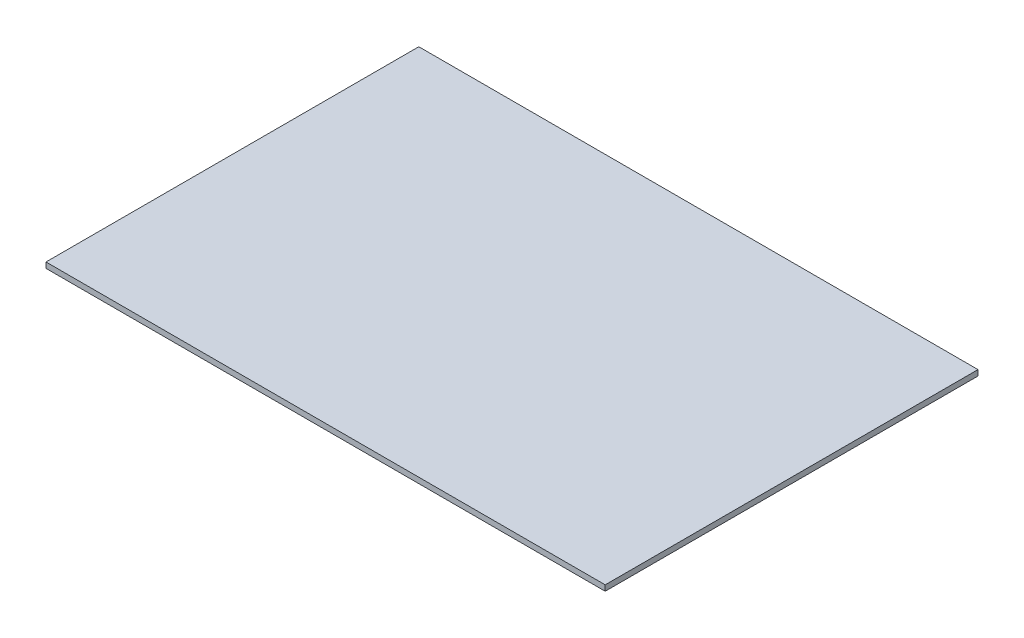
ISO-10303-21;
HEADER;
FILE_DESCRIPTION(('STEP AP214'),'2;1');
FILE_NAME('part.step','',(''),(''),'','','');
FILE_SCHEMA(('AUTOMOTIVE_DESIGN { 1 0 10303 214 1 1 1 1 }'));
ENDSEC;
DATA;
#1=APPLICATION_CONTEXT('core data for automotive mechanical design processes');
#2=APPLICATION_PROTOCOL_DEFINITION('international standard','automotive_design',2000,#1);
#3=PRODUCT_CONTEXT('',#1,'mechanical');
#4=PRODUCT('Part','Part','',(#3));
#5=PRODUCT_RELATED_PRODUCT_CATEGORY('part','',(#4));
#6=PRODUCT_DEFINITION_FORMATION('','',#4);
#7=PRODUCT_DEFINITION_CONTEXT('part definition',#1,'design');
#8=PRODUCT_DEFINITION('design','',#6,#7);
#9=PRODUCT_DEFINITION_SHAPE('','',#8);
#10=(LENGTH_UNIT() NAMED_UNIT(*) SI_UNIT(.MILLI.,.METRE.));
#11=(NAMED_UNIT(*) PLANE_ANGLE_UNIT() SI_UNIT($,.RADIAN.));
#12=(NAMED_UNIT(*) SI_UNIT($,.STERADIAN.) SOLID_ANGLE_UNIT());
#13=UNCERTAINTY_MEASURE_WITH_UNIT(LENGTH_MEASURE(1.E-05),#10,'distance_accuracy_value','');
#14=(GEOMETRIC_REPRESENTATION_CONTEXT(3) GLOBAL_UNCERTAINTY_ASSIGNED_CONTEXT((#13)) GLOBAL_UNIT_ASSIGNED_CONTEXT((#10,
#11,#12)) REPRESENTATION_CONTEXT('',''));
#15=CARTESIAN_POINT('',(0.,0.,0.));
#16=DIRECTION('',(0.,0.,1.));
#17=DIRECTION('',(1.,0.,0.));
#18=AXIS2_PLACEMENT_3D('',#15,#16,#17);
#19=CARTESIAN_POINT('',(150.,3.,-100.));
#20=DIRECTION('',(-1.,0.,0.));
#21=DIRECTION('',(0.,0.,1.));
#22=AXIS2_PLACEMENT_3D('',#19,#20,#21);
#23=PLANE('',#22);
#24=DIRECTION('',(0.,0.,-1.));
#25=VECTOR('',#24,1.);
#26=CARTESIAN_POINT('',(150.,0.,-100.));
#27=LINE('',#26,#25);
#28=CARTESIAN_POINT('',(150.,0.,100.));
#29=VERTEX_POINT('',#28);
#30=CARTESIAN_POINT('',(150.,0.,-100.));
#31=VERTEX_POINT('',#30);
#32=EDGE_CURVE('E96',#29,#31,#27,.T.);
#33=ORIENTED_EDGE('',*,*,#32,.T.);
#34=DIRECTION('',(0.,-1.,0.));
#35=VECTOR('',#34,1.);
#36=CARTESIAN_POINT('',(150.,3.,-100.));
#37=LINE('',#36,#35);
#38=CARTESIAN_POINT('',(150.,3.,-100.));
#39=VERTEX_POINT('',#38);
#40=EDGE_CURVE('E11',#39,#31,#37,.T.);
#41=ORIENTED_EDGE('',*,*,#40,.F.);
#42=DIRECTION('',(0.,0.,-1.));
#43=VECTOR('',#42,1.);
#44=CARTESIAN_POINT('',(150.,3.,-100.));
#45=LINE('',#44,#43);
#46=CARTESIAN_POINT('',(150.,3.,100.));
#47=VERTEX_POINT('',#46);
#48=EDGE_CURVE('E84',#47,#39,#45,.T.);
#49=ORIENTED_EDGE('',*,*,#48,.F.);
#50=DIRECTION('',(0.,-1.,0.));
#51=VECTOR('',#50,1.);
#52=CARTESIAN_POINT('',(150.,3.,100.));
#53=LINE('',#52,#51);
#54=EDGE_CURVE('E92',#47,#29,#53,.T.);
#55=ORIENTED_EDGE('',*,*,#54,.T.);
#56=EDGE_LOOP('',(#33,#41,#49,#55));
#57=FACE_BOUND('',#56,.T.);
#58=ADVANCED_FACE('F33',(#57),#23,.F.);
#59=CARTESIAN_POINT('',(-150.,3.,-100.));
#60=DIRECTION('',(0.,0.,1.));
#61=DIRECTION('',(1.,0.,0.));
#62=AXIS2_PLACEMENT_3D('',#59,#60,#61);
#63=PLANE('',#62);
#64=DIRECTION('',(-1.,0.,0.));
#65=VECTOR('',#64,1.);
#66=CARTESIAN_POINT('',(-150.,0.,-100.));
#67=LINE('',#66,#65);
#68=CARTESIAN_POINT('',(-150.,0.,-100.));
#69=VERTEX_POINT('',#68);
#70=EDGE_CURVE('E88',#31,#69,#67,.T.);
#71=ORIENTED_EDGE('',*,*,#70,.T.);
#72=DIRECTION('',(0.,-1.,0.));
#73=VECTOR('',#72,1.);
#74=CARTESIAN_POINT('',(-150.,3.,-100.));
#75=LINE('',#74,#73);
#76=CARTESIAN_POINT('',(-150.,3.,-100.));
#77=VERTEX_POINT('',#76);
#78=EDGE_CURVE('E41',#77,#69,#75,.T.);
#79=ORIENTED_EDGE('',*,*,#78,.F.);
#80=DIRECTION('',(-1.,0.,0.));
#81=VECTOR('',#80,1.);
#82=CARTESIAN_POINT('',(-150.,3.,-100.));
#83=LINE('',#82,#81);
#84=EDGE_CURVE('E79',#39,#77,#83,.T.);
#85=ORIENTED_EDGE('',*,*,#84,.F.);
#86=ORIENTED_EDGE('',*,*,#40,.T.);
#87=EDGE_LOOP('',(#71,#79,#85,#86));
#88=FACE_BOUND('',#87,.T.);
#89=ADVANCED_FACE('F87',(#88),#63,.F.);
#90=CARTESIAN_POINT('',(-150.,3.,-100.));
#91=DIRECTION('',(1.,0.,0.));
#92=DIRECTION('',(0.,0.,-1.));
#93=AXIS2_PLACEMENT_3D('',#90,#91,#92);
#94=PLANE('',#93);
#95=DIRECTION('',(0.,0.,1.));
#96=VECTOR('',#95,1.);
#97=CARTESIAN_POINT('',(-150.,0.,-100.));
#98=LINE('',#97,#96);
#99=CARTESIAN_POINT('',(-150.,0.,100.));
#100=VERTEX_POINT('',#99);
#101=EDGE_CURVE('E66',#69,#100,#98,.T.);
#102=ORIENTED_EDGE('',*,*,#101,.T.);
#103=DIRECTION('',(0.,-1.,0.));
#104=VECTOR('',#103,1.);
#105=CARTESIAN_POINT('',(-150.,3.,100.));
#106=LINE('',#105,#104);
#107=CARTESIAN_POINT('',(-150.,3.,100.));
#108=VERTEX_POINT('',#107);
#109=EDGE_CURVE('E89',#108,#100,#106,.T.);
#110=ORIENTED_EDGE('',*,*,#109,.F.);
#111=DIRECTION('',(0.,0.,1.));
#112=VECTOR('',#111,1.);
#113=CARTESIAN_POINT('',(-150.,3.,-100.));
#114=LINE('',#113,#112);
#115=EDGE_CURVE('E82',#77,#108,#114,.T.);
#116=ORIENTED_EDGE('',*,*,#115,.F.);
#117=ORIENTED_EDGE('',*,*,#78,.T.);
#118=EDGE_LOOP('',(#102,#110,#116,#117));
#119=FACE_BOUND('',#118,.T.);
#120=ADVANCED_FACE('F90',(#119),#94,.F.);
#121=CARTESIAN_POINT('',(-150.,3.,100.));
#122=DIRECTION('',(0.,0.,-1.));
#123=DIRECTION('',(-1.,0.,0.));
#124=AXIS2_PLACEMENT_3D('',#121,#122,#123);
#125=PLANE('',#124);
#126=DIRECTION('',(1.,0.,0.));
#127=VECTOR('',#126,1.);
#128=CARTESIAN_POINT('',(-150.,0.,100.));
#129=LINE('',#128,#127);
#130=EDGE_CURVE('E72',#100,#29,#129,.T.);
#131=ORIENTED_EDGE('',*,*,#130,.T.);
#132=ORIENTED_EDGE('',*,*,#54,.F.);
#133=DIRECTION('',(1.,0.,0.));
#134=VECTOR('',#133,1.);
#135=CARTESIAN_POINT('',(-150.,3.,100.));
#136=LINE('',#135,#134);
#137=EDGE_CURVE('E49',#108,#47,#136,.T.);
#138=ORIENTED_EDGE('',*,*,#137,.F.);
#139=ORIENTED_EDGE('',*,*,#109,.T.);
#140=EDGE_LOOP('',(#131,#132,#138,#139));
#141=FACE_BOUND('',#140,.T.);
#142=ADVANCED_FACE('F103',(#141),#125,.F.);
#143=CARTESIAN_POINT('',(0.,3.,0.));
#144=DIRECTION('',(0.,1.,0.));
#145=DIRECTION('',(0.,0.,1.));
#146=AXIS2_PLACEMENT_3D('',#143,#144,#145);
#147=PLANE('',#146);
#148=ORIENTED_EDGE('',*,*,#48,.T.);
#149=ORIENTED_EDGE('',*,*,#84,.T.);
#150=ORIENTED_EDGE('',*,*,#115,.T.);
#151=ORIENTED_EDGE('',*,*,#137,.T.);
#152=EDGE_LOOP('',(#148,#149,#150,#151));
#153=FACE_BOUND('',#152,.T.);
#154=ADVANCED_FACE('F80',(#153),#147,.T.);
#155=CARTESIAN_POINT('',(0.,0.,0.));
#156=DIRECTION('',(0.,1.,0.));
#157=DIRECTION('',(0.,0.,1.));
#158=AXIS2_PLACEMENT_3D('',#155,#156,#157);
#159=PLANE('',#158);
#160=ORIENTED_EDGE('',*,*,#32,.F.);
#161=ORIENTED_EDGE('',*,*,#130,.F.);
#162=ORIENTED_EDGE('',*,*,#101,.F.);
#163=ORIENTED_EDGE('',*,*,#70,.F.);
#164=EDGE_LOOP('',(#160,#161,#162,#163));
#165=FACE_BOUND('',#164,.T.);
#166=ADVANCED_FACE('F106',(#165),#159,.F.);
#167=CLOSED_SHELL('',(#58,#89,#120,#142,#154,#166));
#168=MANIFOLD_SOLID_BREP('B2',#167);
#169=ADVANCED_BREP_SHAPE_REPRESENTATION('',(#18,#168),#14);
#170=SHAPE_DEFINITION_REPRESENTATION(#9,#169);
ENDSEC;
END-ISO-10303-21;
